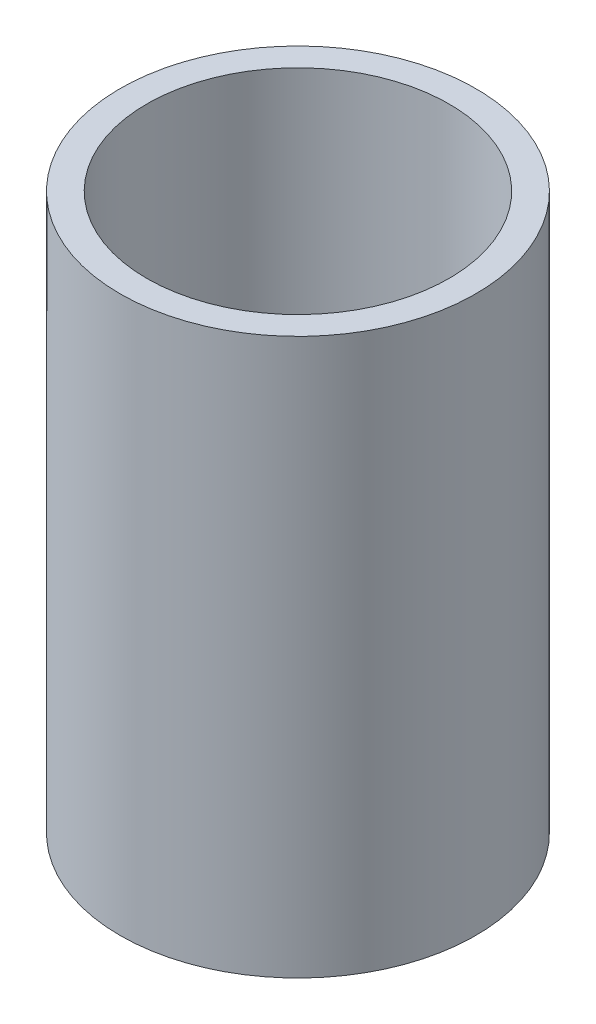
ISO-10303-21;
HEADER;
FILE_DESCRIPTION(('STEP AP214'),'2;1');
FILE_NAME('part.step','',(''),(''),'','','');
FILE_SCHEMA(('AUTOMOTIVE_DESIGN { 1 0 10303 214 1 1 1 1 }'));
ENDSEC;
DATA;
#1=APPLICATION_CONTEXT('core data for automotive mechanical design processes');
#2=APPLICATION_PROTOCOL_DEFINITION('international standard','automotive_design',2000,#1);
#3=PRODUCT_CONTEXT('',#1,'mechanical');
#4=PRODUCT('Part','Part','',(#3));
#5=PRODUCT_RELATED_PRODUCT_CATEGORY('part','',(#4));
#6=PRODUCT_DEFINITION_FORMATION('','',#4);
#7=PRODUCT_DEFINITION_CONTEXT('part definition',#1,'design');
#8=PRODUCT_DEFINITION('design','',#6,#7);
#9=PRODUCT_DEFINITION_SHAPE('','',#8);
#10=(LENGTH_UNIT() NAMED_UNIT(*) SI_UNIT(.MILLI.,.METRE.));
#11=(NAMED_UNIT(*) PLANE_ANGLE_UNIT() SI_UNIT($,.RADIAN.));
#12=(NAMED_UNIT(*) SI_UNIT($,.STERADIAN.) SOLID_ANGLE_UNIT());
#13=UNCERTAINTY_MEASURE_WITH_UNIT(LENGTH_MEASURE(1.E-05),#10,'distance_accuracy_value','');
#14=(GEOMETRIC_REPRESENTATION_CONTEXT(3) GLOBAL_UNCERTAINTY_ASSIGNED_CONTEXT((#13)) GLOBAL_UNIT_ASSIGNED_CONTEXT((#10,
#11,#12)) REPRESENTATION_CONTEXT('',''));
#15=CARTESIAN_POINT('',(0.,0.,0.));
#16=DIRECTION('',(0.,0.,1.));
#17=DIRECTION('',(1.,0.,0.));
#18=AXIS2_PLACEMENT_3D('',#15,#16,#17);
#19=CARTESIAN_POINT('',(0.,50.,0.));
#20=DIRECTION('',(0.,1.,0.));
#21=DIRECTION('',(0.,0.,1.));
#22=AXIS2_PLACEMENT_3D('',#19,#20,#21);
#23=PLANE('',#22);
#24=CARTESIAN_POINT('',(0.,50.,0.));
#25=DIRECTION('',(0.,1.,0.));
#26=DIRECTION('',(0.,0.,1.));
#27=AXIS2_PLACEMENT_3D('',#24,#25,#26);
#28=CIRCLE('',#27,16.);
#29=CARTESIAN_POINT('',(0.,50.,16.));
#30=VERTEX_POINT('',#29);
#31=EDGE_CURVE('E10',#30,#30,#28,.T.);
#32=ORIENTED_EDGE('',*,*,#31,.T.);
#33=EDGE_LOOP('',(#32));
#34=FACE_BOUND('',#33,.T.);
#35=CARTESIAN_POINT('',(0.,50.,0.));
#36=DIRECTION('',(0.,1.,0.));
#37=DIRECTION('',(0.,0.,1.));
#38=AXIS2_PLACEMENT_3D('',#35,#36,#37);
#39=CIRCLE('',#38,13.6);
#40=CARTESIAN_POINT('',(0.,50.,13.6));
#41=VERTEX_POINT('',#40);
#42=EDGE_CURVE('E50',#41,#41,#39,.T.);
#43=ORIENTED_EDGE('',*,*,#42,.F.);
#44=EDGE_LOOP('',(#43));
#45=FACE_BOUND('',#44,.T.);
#46=ADVANCED_FACE('F39',(#34,#45),#23,.T.);
#47=CARTESIAN_POINT('',(0.,0.,0.));
#48=DIRECTION('',(0.,1.,0.));
#49=DIRECTION('',(0.,0.,1.));
#50=AXIS2_PLACEMENT_3D('',#47,#48,#49);
#51=PLANE('',#50);
#52=CARTESIAN_POINT('',(0.,0.,0.));
#53=DIRECTION('',(0.,1.,0.));
#54=DIRECTION('',(0.,0.,1.));
#55=AXIS2_PLACEMENT_3D('',#52,#53,#54);
#56=CIRCLE('',#55,16.);
#57=CARTESIAN_POINT('',(0.,0.,16.));
#58=VERTEX_POINT('',#57);
#59=EDGE_CURVE('E43',#58,#58,#56,.T.);
#60=ORIENTED_EDGE('',*,*,#59,.F.);
#61=EDGE_LOOP('',(#60));
#62=FACE_BOUND('',#61,.T.);
#63=CARTESIAN_POINT('',(0.,0.,0.));
#64=DIRECTION('',(0.,1.,0.));
#65=DIRECTION('',(0.,0.,1.));
#66=AXIS2_PLACEMENT_3D('',#63,#64,#65);
#67=CIRCLE('',#66,13.6);
#68=CARTESIAN_POINT('',(0.,0.,13.6));
#69=VERTEX_POINT('',#68);
#70=EDGE_CURVE('E52',#69,#69,#67,.T.);
#71=ORIENTED_EDGE('',*,*,#70,.T.);
#72=EDGE_LOOP('',(#71));
#73=FACE_BOUND('',#72,.T.);
#74=ADVANCED_FACE('F62',(#62,#73),#51,.F.);
#75=CARTESIAN_POINT('',(0.,50.,0.));
#76=DIRECTION('',(0.,-1.,0.));
#77=DIRECTION('',(0.,0.,-1.));
#78=AXIS2_PLACEMENT_3D('',#75,#76,#77);
#79=CYLINDRICAL_SURFACE('',#78,16.);
#80=ORIENTED_EDGE('',*,*,#31,.F.);
#81=EDGE_LOOP('',(#80));
#82=FACE_BOUND('',#81,.T.);
#83=ORIENTED_EDGE('',*,*,#59,.T.);
#84=EDGE_LOOP('',(#83));
#85=FACE_BOUND('',#84,.T.);
#86=ADVANCED_FACE('F41',(#82,#85),#79,.T.);
#87=CARTESIAN_POINT('',(0.,50.,0.));
#88=DIRECTION('',(0.,-1.,0.));
#89=DIRECTION('',(0.,0.,-1.));
#90=AXIS2_PLACEMENT_3D('',#87,#88,#89);
#91=CYLINDRICAL_SURFACE('',#90,13.6);
#92=ORIENTED_EDGE('',*,*,#42,.T.);
#93=EDGE_LOOP('',(#92));
#94=FACE_BOUND('',#93,.T.);
#95=ORIENTED_EDGE('',*,*,#70,.F.);
#96=EDGE_LOOP('',(#95));
#97=FACE_BOUND('',#96,.T.);
#98=ADVANCED_FACE('F58',(#94,#97),#91,.F.);
#99=CLOSED_SHELL('',(#46,#74,#86,#98));
#100=MANIFOLD_SOLID_BREP('B2',#99);
#101=ADVANCED_BREP_SHAPE_REPRESENTATION('',(#18,#100),#14);
#102=SHAPE_DEFINITION_REPRESENTATION(#9,#101);
ENDSEC;
END-ISO-10303-21;
